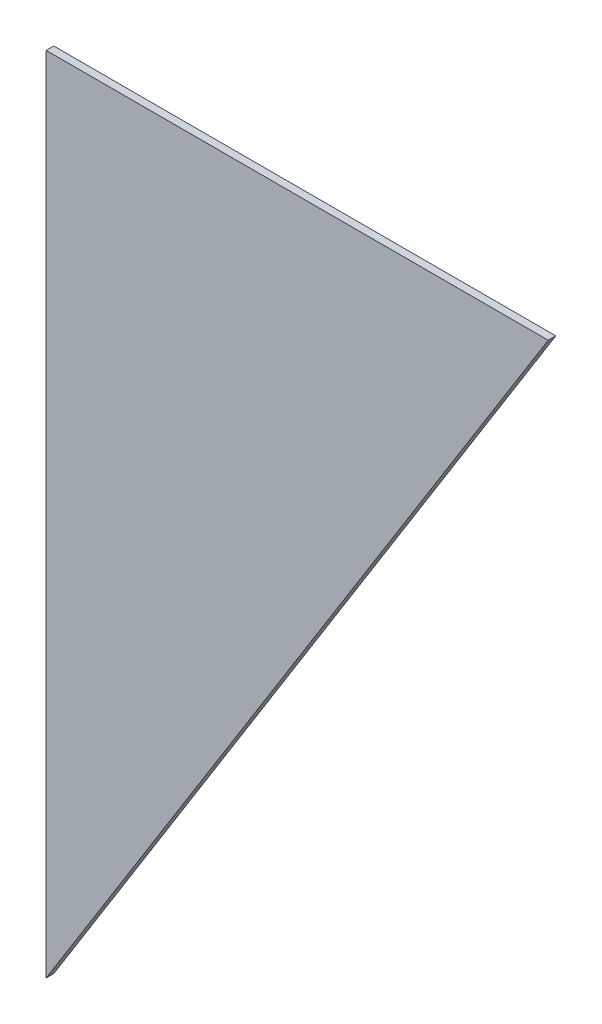
ISO-10303-21;
HEADER;
FILE_DESCRIPTION(('STEP AP214'),'2;1');
FILE_NAME('part.step','',(''),(''),'','','');
FILE_SCHEMA(('AUTOMOTIVE_DESIGN { 1 0 10303 214 1 1 1 1 }'));
ENDSEC;
DATA;
#1=APPLICATION_CONTEXT('core data for automotive mechanical design processes');
#2=APPLICATION_PROTOCOL_DEFINITION('international standard','automotive_design',2000,#1);
#3=PRODUCT_CONTEXT('',#1,'mechanical');
#4=PRODUCT('Part','Part','',(#3));
#5=PRODUCT_RELATED_PRODUCT_CATEGORY('part','',(#4));
#6=PRODUCT_DEFINITION_FORMATION('','',#4);
#7=PRODUCT_DEFINITION_CONTEXT('part definition',#1,'design');
#8=PRODUCT_DEFINITION('design','',#6,#7);
#9=PRODUCT_DEFINITION_SHAPE('','',#8);
#10=(LENGTH_UNIT() NAMED_UNIT(*) SI_UNIT(.MILLI.,.METRE.));
#11=(NAMED_UNIT(*) PLANE_ANGLE_UNIT() SI_UNIT($,.RADIAN.));
#12=(NAMED_UNIT(*) SI_UNIT($,.STERADIAN.) SOLID_ANGLE_UNIT());
#13=UNCERTAINTY_MEASURE_WITH_UNIT(LENGTH_MEASURE(1.E-05),#10,'distance_accuracy_value','');
#14=(GEOMETRIC_REPRESENTATION_CONTEXT(3) GLOBAL_UNCERTAINTY_ASSIGNED_CONTEXT((#13)) GLOBAL_UNIT_ASSIGNED_CONTEXT((#10,
#11,#12)) REPRESENTATION_CONTEXT('',''));
#15=CARTESIAN_POINT('',(0.,0.,0.));
#16=DIRECTION('',(0.,0.,1.));
#17=DIRECTION('',(1.,0.,0.));
#18=AXIS2_PLACEMENT_3D('',#15,#16,#17);
#19=CARTESIAN_POINT('',(0.,-3.,3.));
#20=DIRECTION('',(0.,1.,0.));
#21=DIRECTION('',(-1.,0.,0.));
#22=AXIS2_PLACEMENT_3D('',#19,#20,#21);
#23=PLANE('',#22);
#24=DIRECTION('',(1.,0.,0.));
#25=VECTOR('',#24,1.);
#26=CARTESIAN_POINT('',(0.,-3.,0.));
#27=LINE('',#26,#25);
#28=CARTESIAN_POINT('',(-200.,-3.,0.));
#29=VERTEX_POINT('',#28);
#30=CARTESIAN_POINT('',(-1.875,-3.,0.));
#31=VERTEX_POINT('',#30);
#32=EDGE_CURVE('E70',#29,#31,#27,.T.);
#33=ORIENTED_EDGE('',*,*,#32,.F.);
#34=DIRECTION('',(0.,0.,-1.));
#35=VECTOR('',#34,1.);
#36=CARTESIAN_POINT('',(-200.,-3.,3.));
#37=LINE('',#36,#35);
#38=CARTESIAN_POINT('',(-200.,-3.,3.));
#39=VERTEX_POINT('',#38);
#40=EDGE_CURVE('E11',#39,#29,#37,.T.);
#41=ORIENTED_EDGE('',*,*,#40,.F.);
#42=DIRECTION('',(1.,0.,0.));
#43=VECTOR('',#42,1.);
#44=CARTESIAN_POINT('',(0.,-3.,3.));
#45=LINE('',#44,#43);
#46=CARTESIAN_POINT('',(-1.875,-3.,3.));
#47=VERTEX_POINT('',#46);
#48=EDGE_CURVE('E68',#39,#47,#45,.T.);
#49=ORIENTED_EDGE('',*,*,#48,.T.);
#50=DIRECTION('',(0.,0.,-1.));
#51=VECTOR('',#50,1.);
#52=CARTESIAN_POINT('',(-1.875,-3.,3.));
#53=LINE('',#52,#51);
#54=EDGE_CURVE('E66',#47,#31,#53,.T.);
#55=ORIENTED_EDGE('',*,*,#54,.T.);
#56=EDGE_LOOP('',(#33,#41,#49,#55));
#57=FACE_BOUND('',#56,.T.);
#58=ADVANCED_FACE('F33',(#57),#23,.T.);
#59=CARTESIAN_POINT('',(-200.,0.,3.));
#60=DIRECTION('',(-1.,0.,0.));
#61=DIRECTION('',(0.,-1.,0.));
#62=AXIS2_PLACEMENT_3D('',#59,#60,#61);
#63=PLANE('',#62);
#64=DIRECTION('',(0.,1.,0.));
#65=VECTOR('',#64,1.);
#66=CARTESIAN_POINT('',(-200.,0.,0.));
#67=LINE('',#66,#65);
#68=CARTESIAN_POINT('',(-200.,-320.,0.));
#69=VERTEX_POINT('',#68);
#70=EDGE_CURVE('E84',#69,#29,#67,.T.);
#71=ORIENTED_EDGE('',*,*,#70,.F.);
#72=DIRECTION('',(0.,0.,-1.));
#73=VECTOR('',#72,1.);
#74=CARTESIAN_POINT('',(-200.,-320.,3.));
#75=LINE('',#74,#73);
#76=CARTESIAN_POINT('',(-200.,-320.,3.));
#77=VERTEX_POINT('',#76);
#78=EDGE_CURVE('E41',#77,#69,#75,.T.);
#79=ORIENTED_EDGE('',*,*,#78,.F.);
#80=DIRECTION('',(0.,1.,0.));
#81=VECTOR('',#80,1.);
#82=CARTESIAN_POINT('',(-200.,0.,3.));
#83=LINE('',#82,#81);
#84=EDGE_CURVE('E76',#77,#39,#83,.T.);
#85=ORIENTED_EDGE('',*,*,#84,.T.);
#86=ORIENTED_EDGE('',*,*,#40,.T.);
#87=EDGE_LOOP('',(#71,#79,#85,#86));
#88=FACE_BOUND('',#87,.T.);
#89=ADVANCED_FACE('F79',(#88),#63,.T.);
#90=CARTESIAN_POINT('',(0.,0.,3.));
#91=DIRECTION('',(-0.847998304005088,0.52999894000318,0.));
#92=DIRECTION('',(-0.52999894000318,-0.847998304005088,0.));
#93=AXIS2_PLACEMENT_3D('',#90,#91,#92);
#94=PLANE('',#93);
#95=DIRECTION('',(0.52999894000318,0.847998304005088,0.));
#96=VECTOR('',#95,1.);
#97=CARTESIAN_POINT('',(0.,0.,0.));
#98=LINE('',#97,#96);
#99=EDGE_CURVE('E77',#69,#31,#98,.T.);
#100=ORIENTED_EDGE('',*,*,#99,.T.);
#101=ORIENTED_EDGE('',*,*,#54,.F.);
#102=DIRECTION('',(0.52999894000318,0.847998304005088,0.));
#103=VECTOR('',#102,1.);
#104=CARTESIAN_POINT('',(0.,0.,3.));
#105=LINE('',#104,#103);
#106=EDGE_CURVE('E49',#77,#47,#105,.T.);
#107=ORIENTED_EDGE('',*,*,#106,.F.);
#108=ORIENTED_EDGE('',*,*,#78,.T.);
#109=EDGE_LOOP('',(#100,#101,#107,#108));
#110=FACE_BOUND('',#109,.T.);
#111=ADVANCED_FACE('F87',(#110),#94,.F.);
#112=CARTESIAN_POINT('',(0.,0.,3.));
#113=DIRECTION('',(0.,0.,1.));
#114=DIRECTION('',(1.,0.,0.));
#115=AXIS2_PLACEMENT_3D('',#112,#113,#114);
#116=PLANE('',#115);
#117=ORIENTED_EDGE('',*,*,#48,.F.);
#118=ORIENTED_EDGE('',*,*,#84,.F.);
#119=ORIENTED_EDGE('',*,*,#106,.T.);
#120=EDGE_LOOP('',(#117,#118,#119));
#121=FACE_BOUND('',#120,.T.);
#122=ADVANCED_FACE('F75',(#121),#116,.T.);
#123=CARTESIAN_POINT('',(0.,0.,0.));
#124=DIRECTION('',(0.,0.,1.));
#125=DIRECTION('',(1.,0.,0.));
#126=AXIS2_PLACEMENT_3D('',#123,#124,#125);
#127=PLANE('',#126);
#128=ORIENTED_EDGE('',*,*,#32,.T.);
#129=ORIENTED_EDGE('',*,*,#99,.F.);
#130=ORIENTED_EDGE('',*,*,#70,.T.);
#131=EDGE_LOOP('',(#128,#129,#130));
#132=FACE_BOUND('',#131,.T.);
#133=ADVANCED_FACE('F89',(#132),#127,.F.);
#134=CLOSED_SHELL('',(#58,#89,#111,#122,#133));
#135=MANIFOLD_SOLID_BREP('B2',#134);
#136=ADVANCED_BREP_SHAPE_REPRESENTATION('',(#18,#135),#14);
#137=SHAPE_DEFINITION_REPRESENTATION(#9,#136);
ENDSEC;
END-ISO-10303-21;
